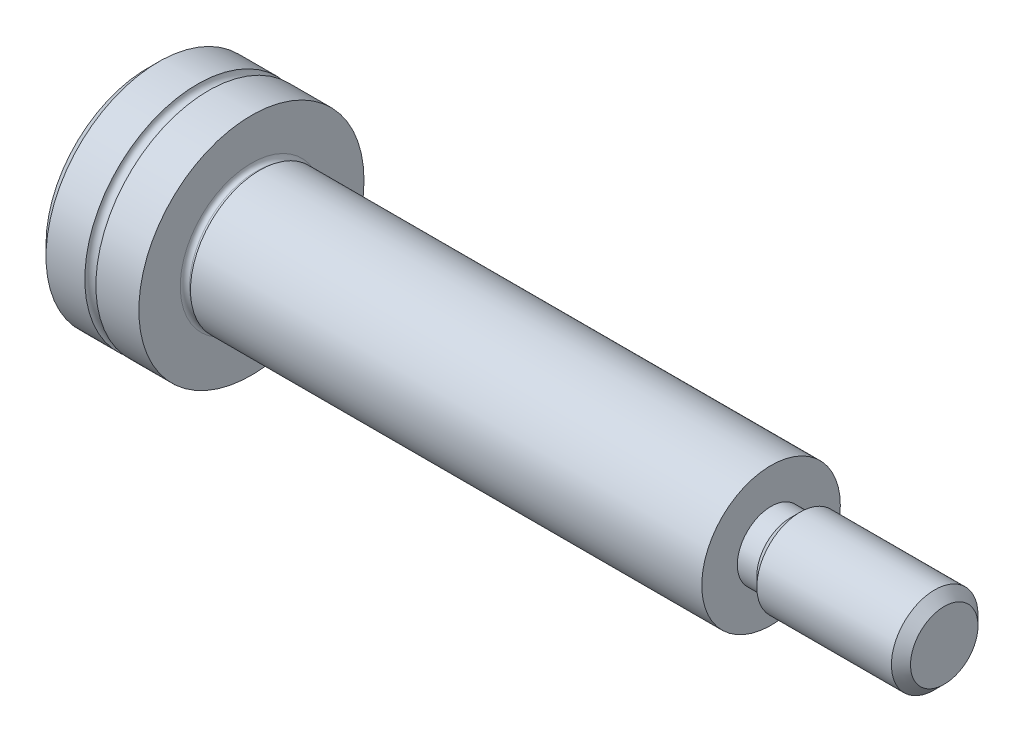
ISO-10303-21;
HEADER;
FILE_DESCRIPTION(('STEP AP214'),'2;1');
FILE_NAME('part.step','',(''),(''),'','','');
FILE_SCHEMA(('AUTOMOTIVE_DESIGN { 1 0 10303 214 1 1 1 1 }'));
ENDSEC;
DATA;
#1=APPLICATION_CONTEXT('core data for automotive mechanical design processes');
#2=APPLICATION_PROTOCOL_DEFINITION('international standard','automotive_design',2000,#1);
#3=PRODUCT_CONTEXT('',#1,'mechanical');
#4=PRODUCT('Part','Part','',(#3));
#5=PRODUCT_RELATED_PRODUCT_CATEGORY('part','',(#4));
#6=PRODUCT_DEFINITION_FORMATION('','',#4);
#7=PRODUCT_DEFINITION_CONTEXT('part definition',#1,'design');
#8=PRODUCT_DEFINITION('design','',#6,#7);
#9=PRODUCT_DEFINITION_SHAPE('','',#8);
#10=(LENGTH_UNIT() NAMED_UNIT(*) SI_UNIT(.MILLI.,.METRE.));
#11=(NAMED_UNIT(*) PLANE_ANGLE_UNIT() SI_UNIT($,.RADIAN.));
#12=(NAMED_UNIT(*) SI_UNIT($,.STERADIAN.) SOLID_ANGLE_UNIT());
#13=UNCERTAINTY_MEASURE_WITH_UNIT(LENGTH_MEASURE(1.E-05),#10,'distance_accuracy_value','');
#14=(GEOMETRIC_REPRESENTATION_CONTEXT(3) GLOBAL_UNCERTAINTY_ASSIGNED_CONTEXT((#13)) GLOBAL_UNIT_ASSIGNED_CONTEXT((#10,
#11,#12)) REPRESENTATION_CONTEXT('',''));
#15=CARTESIAN_POINT('',(0.,0.,0.));
#16=DIRECTION('',(0.,0.,1.));
#17=DIRECTION('',(1.,0.,0.));
#18=AXIS2_PLACEMENT_3D('',#15,#16,#17);
#19=CARTESIAN_POINT('',(-3.,1.2,0.));
#20=DIRECTION('',(1.,0.,0.));
#21=DIRECTION('',(0.,0.,-1.));
#22=AXIS2_PLACEMENT_3D('',#19,#20,#21);
#23=PLANE('',#22);
#24=CARTESIAN_POINT('',(-3.,0.,0.));
#25=DIRECTION('',(1.,0.,0.));
#26=DIRECTION('',(0.,0.,-1.));
#27=AXIS2_PLACEMENT_3D('',#24,#25,#26);
#28=CIRCLE('',#27,2.93);
#29=CARTESIAN_POINT('',(-3.,0.,-2.93));
#30=VERTEX_POINT('',#29);
#31=EDGE_CURVE('E95',#30,#30,#28,.T.);
#32=ORIENTED_EDGE('',*,*,#31,.F.);
#33=EDGE_LOOP('',(#32));
#34=FACE_BOUND('',#33,.T.);
#35=DIRECTION('',(0.,-1.,0.));
#36=VECTOR('',#35,1.);
#37=CARTESIAN_POINT('',(-3.,0.72168783648703,1.25));
#38=LINE('',#37,#36);
#39=CARTESIAN_POINT('',(-3.,0.72168783648703,1.25));
#40=VERTEX_POINT('',#39);
#41=CARTESIAN_POINT('',(-3.,-0.72168783648703,1.25));
#42=VERTEX_POINT('',#41);
#43=EDGE_CURVE('E82',#40,#42,#38,.T.);
#44=ORIENTED_EDGE('',*,*,#43,.T.);
#45=DIRECTION('',(0.,-0.50000000000002,-0.866025403784427));
#46=VECTOR('',#45,1.);
#47=CARTESIAN_POINT('',(-3.,-0.72168783648703,1.25));
#48=LINE('',#47,#46);
#49=CARTESIAN_POINT('',(-3.,-1.4433756729741,0.));
#50=VERTEX_POINT('',#49);
#51=EDGE_CURVE('E71',#42,#50,#48,.T.);
#52=ORIENTED_EDGE('',*,*,#51,.T.);
#53=DIRECTION('',(0.,0.50000000000002,-0.866025403784427));
#54=VECTOR('',#53,1.);
#55=CARTESIAN_POINT('',(-3.,-1.4433756729741,0.));
#56=LINE('',#55,#54);
#57=CARTESIAN_POINT('',(-3.,-0.72168783648703,-1.25));
#58=VERTEX_POINT('',#57);
#59=EDGE_CURVE('E81',#50,#58,#56,.T.);
#60=ORIENTED_EDGE('',*,*,#59,.T.);
#61=DIRECTION('',(0.,1.,0.));
#62=VECTOR('',#61,1.);
#63=CARTESIAN_POINT('',(-3.,-0.72168783648703,-1.25));
#64=LINE('',#63,#62);
#65=CARTESIAN_POINT('',(-3.,0.72168783648703,-1.25));
#66=VERTEX_POINT('',#65);
#67=EDGE_CURVE('E105',#58,#66,#64,.T.);
#68=ORIENTED_EDGE('',*,*,#67,.T.);
#69=DIRECTION('',(0.,0.50000000000002,0.866025403784427));
#70=VECTOR('',#69,1.);
#71=CARTESIAN_POINT('',(-3.,0.72168783648703,-1.25));
#72=LINE('',#71,#70);
#73=CARTESIAN_POINT('',(-3.,1.4433756729741,0.));
#74=VERTEX_POINT('',#73);
#75=EDGE_CURVE('E110',#66,#74,#72,.T.);
#76=ORIENTED_EDGE('',*,*,#75,.T.);
#77=DIRECTION('',(0.,-0.50000000000002,0.866025403784427));
#78=VECTOR('',#77,1.);
#79=CARTESIAN_POINT('',(-3.,1.4433756729741,0.));
#80=LINE('',#79,#78);
#81=EDGE_CURVE('E94',#74,#40,#80,.T.);
#82=ORIENTED_EDGE('',*,*,#81,.T.);
#83=EDGE_LOOP('',(#44,#52,#60,#68,#76,#82));
#84=FACE_BOUND('',#83,.T.);
#85=ADVANCED_FACE('F17',(#34,#84),#23,.F.);
#86=CARTESIAN_POINT('',(-3.,0.,0.));
#87=DIRECTION('',(1.,0.,0.));
#88=DIRECTION('',(0.,0.,-1.));
#89=AXIS2_PLACEMENT_3D('',#86,#87,#88);
#90=CONICAL_SURFACE('',#89,2.93,0.785398163397446);
#91=CARTESIAN_POINT('',(-2.68,0.,0.));
#92=DIRECTION('',(1.,0.,0.));
#93=DIRECTION('',(0.,0.,-1.));
#94=AXIS2_PLACEMENT_3D('',#91,#92,#93);
#95=CIRCLE('',#94,3.25);
#96=CARTESIAN_POINT('',(-2.68,0.,-3.25));
#97=VERTEX_POINT('',#96);
#98=EDGE_CURVE('E117',#97,#97,#95,.T.);
#99=ORIENTED_EDGE('',*,*,#98,.F.);
#100=EDGE_LOOP('',(#99));
#101=FACE_BOUND('',#100,.T.);
#102=ORIENTED_EDGE('',*,*,#31,.T.);
#103=EDGE_LOOP('',(#102));
#104=FACE_BOUND('',#103,.T.);
#105=ADVANCED_FACE('F284',(#101,#104),#90,.T.);
#106=CARTESIAN_POINT('',(-1.4,0.72168783648703,1.25));
#107=DIRECTION('',(0.,0.,-1.));
#108=DIRECTION('',(-1.,0.,0.));
#109=AXIS2_PLACEMENT_3D('',#106,#107,#108);
#110=PLANE('',#109);
#111=ORIENTED_EDGE('',*,*,#43,.F.);
#112=DIRECTION('',(-1.,0.,0.));
#113=VECTOR('',#112,1.);
#114=CARTESIAN_POINT('',(-1.4,0.72168783648703,1.25));
#115=LINE('',#114,#113);
#116=CARTESIAN_POINT('',(-1.4,0.72168783648703,1.25));
#117=VERTEX_POINT('',#116);
#118=EDGE_CURVE('E122',#117,#40,#115,.T.);
#119=ORIENTED_EDGE('',*,*,#118,.F.);
#120=DIRECTION('',(0.,-1.,0.));
#121=VECTOR('',#120,1.);
#122=CARTESIAN_POINT('',(-1.4,0.72168783648703,1.25));
#123=LINE('',#122,#121);
#124=CARTESIAN_POINT('',(-1.4,-0.72168783648703,1.25));
#125=VERTEX_POINT('',#124);
#126=EDGE_CURVE('E89',#117,#125,#123,.T.);
#127=ORIENTED_EDGE('',*,*,#126,.T.);
#128=DIRECTION('',(-1.,0.,0.));
#129=VECTOR('',#128,1.);
#130=CARTESIAN_POINT('',(-1.4,-0.72168783648703,1.25));
#131=LINE('',#130,#129);
#132=EDGE_CURVE('E75',#125,#42,#131,.T.);
#133=ORIENTED_EDGE('',*,*,#132,.T.);
#134=EDGE_LOOP('',(#111,#119,#127,#133));
#135=FACE_BOUND('',#134,.T.);
#136=ADVANCED_FACE('F87',(#135),#110,.T.);
#137=CARTESIAN_POINT('',(-1.4,-0.72168783648703,1.25));
#138=DIRECTION('',(0.,0.866025403784427,-0.50000000000002));
#139=DIRECTION('',(0.,0.50000000000002,0.866025403784427));
#140=AXIS2_PLACEMENT_3D('',#137,#138,#139);
#141=PLANE('',#140);
#142=ORIENTED_EDGE('',*,*,#51,.F.);
#143=ORIENTED_EDGE('',*,*,#132,.F.);
#144=DIRECTION('',(0.,-0.50000000000002,-0.866025403784427));
#145=VECTOR('',#144,1.);
#146=CARTESIAN_POINT('',(-1.4,-0.72168783648703,1.25));
#147=LINE('',#146,#145);
#148=CARTESIAN_POINT('',(-1.4,-1.4433756729741,0.));
#149=VERTEX_POINT('',#148);
#150=EDGE_CURVE('E90',#125,#149,#147,.T.);
#151=ORIENTED_EDGE('',*,*,#150,.T.);
#152=DIRECTION('',(-1.,0.,0.));
#153=VECTOR('',#152,1.);
#154=CARTESIAN_POINT('',(-1.4,-1.4433756729741,0.));
#155=LINE('',#154,#153);
#156=EDGE_CURVE('E77',#149,#50,#155,.T.);
#157=ORIENTED_EDGE('',*,*,#156,.T.);
#158=EDGE_LOOP('',(#142,#143,#151,#157));
#159=FACE_BOUND('',#158,.T.);
#160=ADVANCED_FACE('F73',(#159),#141,.T.);
#161=CARTESIAN_POINT('',(-1.4,-1.4433756729741,0.));
#162=DIRECTION('',(0.,0.866025403784427,0.50000000000002));
#163=DIRECTION('',(0.,-0.50000000000002,0.866025403784427));
#164=AXIS2_PLACEMENT_3D('',#161,#162,#163);
#165=PLANE('',#164);
#166=ORIENTED_EDGE('',*,*,#59,.F.);
#167=ORIENTED_EDGE('',*,*,#156,.F.);
#168=DIRECTION('',(0.,0.50000000000002,-0.866025403784427));
#169=VECTOR('',#168,1.);
#170=CARTESIAN_POINT('',(-1.4,-1.4433756729741,0.));
#171=LINE('',#170,#169);
#172=CARTESIAN_POINT('',(-1.4,-0.72168783648703,-1.25));
#173=VERTEX_POINT('',#172);
#174=EDGE_CURVE('E135',#149,#173,#171,.T.);
#175=ORIENTED_EDGE('',*,*,#174,.T.);
#176=DIRECTION('',(-1.,0.,0.));
#177=VECTOR('',#176,1.);
#178=CARTESIAN_POINT('',(-1.4,-0.72168783648703,-1.25));
#179=LINE('',#178,#177);
#180=EDGE_CURVE('E140',#173,#58,#179,.T.);
#181=ORIENTED_EDGE('',*,*,#180,.T.);
#182=EDGE_LOOP('',(#166,#167,#175,#181));
#183=FACE_BOUND('',#182,.T.);
#184=ADVANCED_FACE('F300',(#183),#165,.T.);
#185=CARTESIAN_POINT('',(-1.4,-0.72168783648703,-1.25));
#186=DIRECTION('',(0.,0.,1.));
#187=DIRECTION('',(1.,0.,0.));
#188=AXIS2_PLACEMENT_3D('',#185,#186,#187);
#189=PLANE('',#188);
#190=ORIENTED_EDGE('',*,*,#67,.F.);
#191=ORIENTED_EDGE('',*,*,#180,.F.);
#192=DIRECTION('',(0.,1.,0.));
#193=VECTOR('',#192,1.);
#194=CARTESIAN_POINT('',(-1.4,-0.72168783648703,-1.25));
#195=LINE('',#194,#193);
#196=CARTESIAN_POINT('',(-1.4,0.72168783648703,-1.25));
#197=VERTEX_POINT('',#196);
#198=EDGE_CURVE('E145',#173,#197,#195,.T.);
#199=ORIENTED_EDGE('',*,*,#198,.T.);
#200=DIRECTION('',(-1.,0.,0.));
#201=VECTOR('',#200,1.);
#202=CARTESIAN_POINT('',(-1.4,0.72168783648703,-1.25));
#203=LINE('',#202,#201);
#204=EDGE_CURVE('E150',#197,#66,#203,.T.);
#205=ORIENTED_EDGE('',*,*,#204,.T.);
#206=EDGE_LOOP('',(#190,#191,#199,#205));
#207=FACE_BOUND('',#206,.T.);
#208=ADVANCED_FACE('F303',(#207),#189,.T.);
#209=CARTESIAN_POINT('',(-1.4,0.72168783648703,-1.25));
#210=DIRECTION('',(0.,-0.866025403784427,0.50000000000002));
#211=DIRECTION('',(0.,-0.50000000000002,-0.866025403784427));
#212=AXIS2_PLACEMENT_3D('',#209,#210,#211);
#213=PLANE('',#212);
#214=ORIENTED_EDGE('',*,*,#75,.F.);
#215=ORIENTED_EDGE('',*,*,#204,.F.);
#216=DIRECTION('',(0.,0.50000000000002,0.866025403784427));
#217=VECTOR('',#216,1.);
#218=CARTESIAN_POINT('',(-1.4,0.72168783648703,-1.25));
#219=LINE('',#218,#217);
#220=CARTESIAN_POINT('',(-1.4,1.4433756729741,0.));
#221=VERTEX_POINT('',#220);
#222=EDGE_CURVE('E155',#197,#221,#219,.T.);
#223=ORIENTED_EDGE('',*,*,#222,.T.);
#224=DIRECTION('',(-1.,0.,0.));
#225=VECTOR('',#224,1.);
#226=CARTESIAN_POINT('',(-1.4,1.4433756729741,0.));
#227=LINE('',#226,#225);
#228=EDGE_CURVE('E159',#221,#74,#227,.T.);
#229=ORIENTED_EDGE('',*,*,#228,.T.);
#230=EDGE_LOOP('',(#214,#215,#223,#229));
#231=FACE_BOUND('',#230,.T.);
#232=ADVANCED_FACE('F307',(#231),#213,.T.);
#233=CARTESIAN_POINT('',(-1.4,1.4433756729741,0.));
#234=DIRECTION('',(0.,-0.866025403784427,-0.50000000000002));
#235=DIRECTION('',(0.,0.50000000000002,-0.866025403784427));
#236=AXIS2_PLACEMENT_3D('',#233,#234,#235);
#237=PLANE('',#236);
#238=ORIENTED_EDGE('',*,*,#81,.F.);
#239=ORIENTED_EDGE('',*,*,#228,.F.);
#240=DIRECTION('',(0.,-0.50000000000002,0.866025403784427));
#241=VECTOR('',#240,1.);
#242=CARTESIAN_POINT('',(-1.4,1.4433756729741,0.));
#243=LINE('',#242,#241);
#244=EDGE_CURVE('E35',#221,#117,#243,.T.);
#245=ORIENTED_EDGE('',*,*,#244,.T.);
#246=ORIENTED_EDGE('',*,*,#118,.T.);
#247=EDGE_LOOP('',(#238,#239,#245,#246));
#248=FACE_BOUND('',#247,.T.);
#249=ADVANCED_FACE('F280',(#248),#237,.T.);
#250=CARTESIAN_POINT('',(20.,0.,0.));
#251=DIRECTION('',(1.,0.,0.));
#252=DIRECTION('',(0.,0.,-1.));
#253=AXIS2_PLACEMENT_3D('',#250,#251,#252);
#254=CYLINDRICAL_SURFACE('',#253,3.25);
#255=CARTESIAN_POINT('',(-1.56,0.,0.));
#256=DIRECTION('',(1.,0.,0.));
#257=DIRECTION('',(0.,0.,-1.));
#258=AXIS2_PLACEMENT_3D('',#255,#256,#257);
#259=CIRCLE('',#258,3.25);
#260=CARTESIAN_POINT('',(-1.56,0.,-3.25));
#261=VERTEX_POINT('',#260);
#262=EDGE_CURVE('E167',#261,#261,#259,.T.);
#263=ORIENTED_EDGE('',*,*,#262,.F.);
#264=EDGE_LOOP('',(#263));
#265=FACE_BOUND('',#264,.T.);
#266=ORIENTED_EDGE('',*,*,#98,.T.);
#267=EDGE_LOOP('',(#266));
#268=FACE_BOUND('',#267,.T.);
#269=ADVANCED_FACE('F277',(#265,#268),#254,.T.);
#270=CARTESIAN_POINT('',(-1.4,0.,0.));
#271=DIRECTION('',(1.,0.,0.));
#272=DIRECTION('',(0.,0.,-1.));
#273=AXIS2_PLACEMENT_3D('',#270,#271,#272);
#274=PLANE('',#273);
#275=ORIENTED_EDGE('',*,*,#126,.F.);
#276=ORIENTED_EDGE('',*,*,#244,.F.);
#277=ORIENTED_EDGE('',*,*,#222,.F.);
#278=ORIENTED_EDGE('',*,*,#198,.F.);
#279=ORIENTED_EDGE('',*,*,#174,.F.);
#280=ORIENTED_EDGE('',*,*,#150,.F.);
#281=EDGE_LOOP('',(#275,#276,#277,#278,#279,#280));
#282=FACE_BOUND('',#281,.T.);
#283=CARTESIAN_POINT('',(-1.4,0.,0.));
#284=DIRECTION('',(-1.,0.,0.));
#285=DIRECTION('',(0.,0.,-1.));
#286=AXIS2_PLACEMENT_3D('',#283,#284,#285);
#287=CIRCLE('',#286,1.2);
#288=CARTESIAN_POINT('',(-1.4,0.,-1.2));
#289=VERTEX_POINT('',#288);
#290=EDGE_CURVE('E172',#289,#289,#287,.T.);
#291=ORIENTED_EDGE('',*,*,#290,.F.);
#292=EDGE_LOOP('',(#291));
#293=FACE_BOUND('',#292,.T.);
#294=ADVANCED_FACE('F273',(#282,#293),#274,.F.);
#295=CARTESIAN_POINT('',(-1.40000000000016,0.,0.));
#296=DIRECTION('',(1.,0.,0.));
#297=DIRECTION('',(0.,0.,-1.));
#298=AXIS2_PLACEMENT_3D('',#295,#296,#297);
#299=TOROIDAL_SURFACE('',#298,3.25000000000016,0.160000000000162);
#300=CARTESIAN_POINT('',(-1.24,0.,0.));
#301=DIRECTION('',(1.,0.,0.));
#302=DIRECTION('',(0.,0.,-1.));
#303=AXIS2_PLACEMENT_3D('',#300,#301,#302);
#304=CIRCLE('',#303,3.25);
#305=CARTESIAN_POINT('',(-1.24,0.,-3.25));
#306=VERTEX_POINT('',#305);
#307=EDGE_CURVE('E175',#306,#306,#304,.T.);
#308=ORIENTED_EDGE('',*,*,#307,.F.);
#309=EDGE_LOOP('',(#308));
#310=FACE_BOUND('',#309,.T.);
#311=ORIENTED_EDGE('',*,*,#262,.T.);
#312=EDGE_LOOP('',(#311));
#313=FACE_BOUND('',#312,.T.);
#314=ADVANCED_FACE('F270',(#310,#313),#299,.F.);
#315=CARTESIAN_POINT('',(-0.707179676972449,0.,0.));
#316=DIRECTION('',(-1.,0.,0.));
#317=DIRECTION('',(0.,0.,1.));
#318=AXIS2_PLACEMENT_3D('',#315,#316,#317);
#319=CONICAL_SURFACE('',#318,0.,1.0471975511966);
#320=ORIENTED_EDGE('',*,*,#290,.T.);
#321=EDGE_LOOP('',(#320));
#322=FACE_BOUND('',#321,.T.);
#323=CARTESIAN_POINT('',(-0.70717967697245,0.,0.));
#324=VERTEX_POINT('',#323);
#325=VERTEX_LOOP('',#324);
#326=FACE_BOUND('',#325,.T.);
#327=ADVANCED_FACE('F266',(#322,#326),#319,.F.);
#328=CARTESIAN_POINT('',(20.,0.,0.));
#329=DIRECTION('',(1.,0.,0.));
#330=DIRECTION('',(0.,0.,-1.));
#331=AXIS2_PLACEMENT_3D('',#328,#329,#330);
#332=CYLINDRICAL_SURFACE('',#331,3.25);
#333=CARTESIAN_POINT('',(0.,0.,0.));
#334=DIRECTION('',(1.,0.,0.));
#335=DIRECTION('',(0.,0.,-1.));
#336=AXIS2_PLACEMENT_3D('',#333,#334,#335);
#337=CIRCLE('',#336,3.25);
#338=CARTESIAN_POINT('',(0.,0.,-3.25));
#339=VERTEX_POINT('',#338);
#340=EDGE_CURVE('E178',#339,#339,#337,.T.);
#341=ORIENTED_EDGE('',*,*,#340,.F.);
#342=EDGE_LOOP('',(#341));
#343=FACE_BOUND('',#342,.T.);
#344=ORIENTED_EDGE('',*,*,#307,.T.);
#345=EDGE_LOOP('',(#344));
#346=FACE_BOUND('',#345,.T.);
#347=ADVANCED_FACE('F260',(#343,#346),#332,.T.);
#348=CARTESIAN_POINT('',(0.,3.25,0.));
#349=DIRECTION('',(-1.,0.,0.));
#350=DIRECTION('',(0.,0.,1.));
#351=AXIS2_PLACEMENT_3D('',#348,#349,#350);
#352=PLANE('',#351);
#353=CARTESIAN_POINT('',(0.,0.,0.));
#354=DIRECTION('',(1.,0.,0.));
#355=DIRECTION('',(0.,0.,-1.));
#356=AXIS2_PLACEMENT_3D('',#353,#354,#355);
#357=CIRCLE('',#356,2.05499999999997);
#358=CARTESIAN_POINT('',(0.,0.,-2.05499999999997));
#359=VERTEX_POINT('',#358);
#360=EDGE_CURVE('E181',#359,#359,#357,.T.);
#361=ORIENTED_EDGE('',*,*,#360,.F.);
#362=EDGE_LOOP('',(#361));
#363=FACE_BOUND('',#362,.T.);
#364=ORIENTED_EDGE('',*,*,#340,.T.);
#365=EDGE_LOOP('',(#364));
#366=FACE_BOUND('',#365,.T.);
#367=ADVANCED_FACE('F254',(#363,#366),#352,.F.);
#368=CARTESIAN_POINT('',(0.134999999999972,0.,0.));
#369=DIRECTION('',(1.,0.,0.));
#370=DIRECTION('',(0.,0.,-1.));
#371=AXIS2_PLACEMENT_3D('',#368,#369,#370);
#372=TOROIDAL_SURFACE('',#371,2.05499999999997,0.134999999999972);
#373=CARTESIAN_POINT('',(0.135000000000002,0.,0.));
#374=DIRECTION('',(1.,0.,0.));
#375=DIRECTION('',(0.,0.,-1.));
#376=AXIS2_PLACEMENT_3D('',#373,#374,#375);
#377=CIRCLE('',#376,1.92);
#378=CARTESIAN_POINT('',(0.135000000000002,0.,-1.92));
#379=VERTEX_POINT('',#378);
#380=EDGE_CURVE('E184',#379,#379,#377,.T.);
#381=ORIENTED_EDGE('',*,*,#380,.F.);
#382=EDGE_LOOP('',(#381));
#383=FACE_BOUND('',#382,.T.);
#384=ORIENTED_EDGE('',*,*,#360,.T.);
#385=EDGE_LOOP('',(#384));
#386=FACE_BOUND('',#385,.T.);
#387=ADVANCED_FACE('F248',(#383,#386),#372,.F.);
#388=CARTESIAN_POINT('',(20.,0.,0.));
#389=DIRECTION('',(1.,0.,0.));
#390=DIRECTION('',(0.,0.,-1.));
#391=AXIS2_PLACEMENT_3D('',#388,#389,#390);
#392=CYLINDRICAL_SURFACE('',#391,1.92);
#393=CARTESIAN_POINT('',(0.193811978464829,0.,0.));
#394=DIRECTION('',(1.,0.,0.));
#395=DIRECTION('',(0.,0.,-1.));
#396=AXIS2_PLACEMENT_3D('',#393,#394,#395);
#397=CIRCLE('',#396,1.92);
#398=CARTESIAN_POINT('',(0.193811978464829,0.,-1.92));
#399=VERTEX_POINT('',#398);
#400=EDGE_CURVE('E187',#399,#399,#397,.T.);
#401=ORIENTED_EDGE('',*,*,#400,.F.);
#402=EDGE_LOOP('',(#401));
#403=FACE_BOUND('',#402,.T.);
#404=ORIENTED_EDGE('',*,*,#380,.T.);
#405=EDGE_LOOP('',(#404));
#406=FACE_BOUND('',#405,.T.);
#407=ADVANCED_FACE('F242',(#403,#406),#392,.T.);
#408=CARTESIAN_POINT('',(0.193811978464829,0.,0.));
#409=DIRECTION('',(1.,0.,0.));
#410=DIRECTION('',(0.,0.,-1.));
#411=AXIS2_PLACEMENT_3D('',#408,#409,#410);
#412=CONICAL_SURFACE('',#411,1.92,1.04719755119658);
#413=CARTESIAN_POINT('',(0.239999999999998,0.,0.));
#414=DIRECTION('',(1.,0.,0.));
#415=DIRECTION('',(0.,0.,-1.));
#416=AXIS2_PLACEMENT_3D('',#413,#414,#415);
#417=CIRCLE('',#416,2.);
#418=CARTESIAN_POINT('',(0.239999999999998,0.,-2.));
#419=VERTEX_POINT('',#418);
#420=EDGE_CURVE('E190',#419,#419,#417,.T.);
#421=ORIENTED_EDGE('',*,*,#420,.F.);
#422=EDGE_LOOP('',(#421));
#423=FACE_BOUND('',#422,.T.);
#424=ORIENTED_EDGE('',*,*,#400,.T.);
#425=EDGE_LOOP('',(#424));
#426=FACE_BOUND('',#425,.T.);
#427=ADVANCED_FACE('F236',(#423,#426),#412,.T.);
#428=CARTESIAN_POINT('',(20.,0.,0.));
#429=DIRECTION('',(1.,0.,0.));
#430=DIRECTION('',(0.,0.,-1.));
#431=AXIS2_PLACEMENT_3D('',#428,#429,#430);
#432=CYLINDRICAL_SURFACE('',#431,2.);
#433=CARTESIAN_POINT('',(15.,0.,0.));
#434=DIRECTION('',(1.,0.,0.));
#435=DIRECTION('',(0.,0.,-1.));
#436=AXIS2_PLACEMENT_3D('',#433,#434,#435);
#437=CIRCLE('',#436,2.);
#438=CARTESIAN_POINT('',(15.,0.,-2.));
#439=VERTEX_POINT('',#438);
#440=EDGE_CURVE('E193',#439,#439,#437,.T.);
#441=ORIENTED_EDGE('',*,*,#440,.F.);
#442=EDGE_LOOP('',(#441));
#443=FACE_BOUND('',#442,.T.);
#444=ORIENTED_EDGE('',*,*,#420,.T.);
#445=EDGE_LOOP('',(#444));
#446=FACE_BOUND('',#445,.T.);
#447=ADVANCED_FACE('F230',(#443,#446),#432,.T.);
#448=CARTESIAN_POINT('',(15.,2.,0.));
#449=DIRECTION('',(-1.,0.,0.));
#450=DIRECTION('',(0.,0.,1.));
#451=AXIS2_PLACEMENT_3D('',#448,#449,#450);
#452=PLANE('',#451);
#453=CARTESIAN_POINT('',(15.,0.,0.));
#454=DIRECTION('',(1.,0.,0.));
#455=DIRECTION('',(0.,0.,-1.));
#456=AXIS2_PLACEMENT_3D('',#453,#454,#455);
#457=CIRCLE('',#456,0.974);
#458=CARTESIAN_POINT('',(15.,0.,-0.974));
#459=VERTEX_POINT('',#458);
#460=EDGE_CURVE('E196',#459,#459,#457,.T.);
#461=ORIENTED_EDGE('',*,*,#460,.F.);
#462=EDGE_LOOP('',(#461));
#463=FACE_BOUND('',#462,.T.);
#464=ORIENTED_EDGE('',*,*,#440,.T.);
#465=EDGE_LOOP('',(#464));
#466=FACE_BOUND('',#465,.T.);
#467=ADVANCED_FACE('F224',(#463,#466),#452,.F.);
#468=CARTESIAN_POINT('',(20.,0.,0.));
#469=DIRECTION('',(1.,0.,0.));
#470=DIRECTION('',(0.,0.,-1.));
#471=AXIS2_PLACEMENT_3D('',#468,#469,#470);
#472=CYLINDRICAL_SURFACE('',#471,0.974);
#473=CARTESIAN_POINT('',(15.5625,0.,0.));
#474=DIRECTION('',(1.,0.,0.));
#475=DIRECTION('',(0.,0.,-1.));
#476=AXIS2_PLACEMENT_3D('',#473,#474,#475);
#477=CIRCLE('',#476,0.974);
#478=CARTESIAN_POINT('',(15.5625,0.,-0.974));
#479=VERTEX_POINT('',#478);
#480=EDGE_CURVE('E199',#479,#479,#477,.T.);
#481=ORIENTED_EDGE('',*,*,#480,.F.);
#482=EDGE_LOOP('',(#481));
#483=FACE_BOUND('',#482,.T.);
#484=ORIENTED_EDGE('',*,*,#460,.T.);
#485=EDGE_LOOP('',(#484));
#486=FACE_BOUND('',#485,.T.);
#487=ADVANCED_FACE('F218',(#483,#486),#472,.T.);
#488=CARTESIAN_POINT('',(15.5625,0.,0.));
#489=DIRECTION('',(1.,0.,0.));
#490=DIRECTION('',(0.,0.,-1.));
#491=AXIS2_PLACEMENT_3D('',#488,#489,#490);
#492=CONICAL_SURFACE('',#491,0.974,0.78539816339745);
#493=CARTESIAN_POINT('',(15.8385,0.,0.));
#494=DIRECTION('',(1.,0.,0.));
#495=DIRECTION('',(0.,0.,-1.));
#496=AXIS2_PLACEMENT_3D('',#493,#494,#495);
#497=CIRCLE('',#496,1.25);
#498=CARTESIAN_POINT('',(15.8385,0.,-1.25));
#499=VERTEX_POINT('',#498);
#500=EDGE_CURVE('E202',#499,#499,#497,.T.);
#501=ORIENTED_EDGE('',*,*,#500,.F.);
#502=EDGE_LOOP('',(#501));
#503=FACE_BOUND('',#502,.T.);
#504=ORIENTED_EDGE('',*,*,#480,.T.);
#505=EDGE_LOOP('',(#504));
#506=FACE_BOUND('',#505,.T.);
#507=ADVANCED_FACE('F212',(#503,#506),#492,.T.);
#508=CARTESIAN_POINT('',(20.,0.,0.));
#509=DIRECTION('',(1.,0.,0.));
#510=DIRECTION('',(0.,0.,-1.));
#511=AXIS2_PLACEMENT_3D('',#508,#509,#510);
#512=CYLINDRICAL_SURFACE('',#511,1.25);
#513=CARTESIAN_POINT('',(19.724,0.,0.));
#514=DIRECTION('',(1.,0.,0.));
#515=DIRECTION('',(0.,0.,-1.));
#516=AXIS2_PLACEMENT_3D('',#513,#514,#515);
#517=CIRCLE('',#516,1.25);
#518=CARTESIAN_POINT('',(19.724,0.,-1.25));
#519=VERTEX_POINT('',#518);
#520=EDGE_CURVE('E25',#519,#519,#517,.T.);
#521=ORIENTED_EDGE('',*,*,#520,.F.);
#522=EDGE_LOOP('',(#521));
#523=FACE_BOUND('',#522,.T.);
#524=ORIENTED_EDGE('',*,*,#500,.T.);
#525=EDGE_LOOP('',(#524));
#526=FACE_BOUND('',#525,.T.);
#527=ADVANCED_FACE('F209',(#523,#526),#512,.T.);
#528=CARTESIAN_POINT('',(19.724,0.,0.));
#529=DIRECTION('',(-1.,0.,0.));
#530=DIRECTION('',(0.,0.,1.));
#531=AXIS2_PLACEMENT_3D('',#528,#529,#530);
#532=CONICAL_SURFACE('',#531,1.25,0.78539816339745);
#533=CARTESIAN_POINT('',(20.,0.,0.));
#534=DIRECTION('',(1.,0.,0.));
#535=DIRECTION('',(0.,0.,-1.));
#536=AXIS2_PLACEMENT_3D('',#533,#534,#535);
#537=CIRCLE('',#536,0.973999999999999);
#538=CARTESIAN_POINT('',(20.,0.,-0.973999999999999));
#539=VERTEX_POINT('',#538);
#540=EDGE_CURVE('E11',#539,#539,#537,.T.);
#541=ORIENTED_EDGE('',*,*,#540,.F.);
#542=EDGE_LOOP('',(#541));
#543=FACE_BOUND('',#542,.T.);
#544=ORIENTED_EDGE('',*,*,#520,.T.);
#545=EDGE_LOOP('',(#544));
#546=FACE_BOUND('',#545,.T.);
#547=ADVANCED_FACE('F207',(#543,#546),#532,.T.);
#548=CARTESIAN_POINT('',(20.,0.974,0.));
#549=DIRECTION('',(-1.,0.,0.));
#550=DIRECTION('',(0.,0.,1.));
#551=AXIS2_PLACEMENT_3D('',#548,#549,#550);
#552=PLANE('',#551);
#553=ORIENTED_EDGE('',*,*,#540,.T.);
#554=EDGE_LOOP('',(#553));
#555=FACE_BOUND('',#554,.T.);
#556=ADVANCED_FACE('F19',(#555),#552,.F.);
#557=CLOSED_SHELL('',(#85,#105,#136,#160,#184,#208,#232,#249,#269,#294,#314,#327,#347,#367,#387,
#407,#427,#447,#467,#487,#507,#527,#547,#556));
#558=MANIFOLD_SOLID_BREP('B1',#557);
#559=ADVANCED_BREP_SHAPE_REPRESENTATION('',(#18,#558),#14);
#560=SHAPE_DEFINITION_REPRESENTATION(#9,#559);
ENDSEC;
END-ISO-10303-21;
